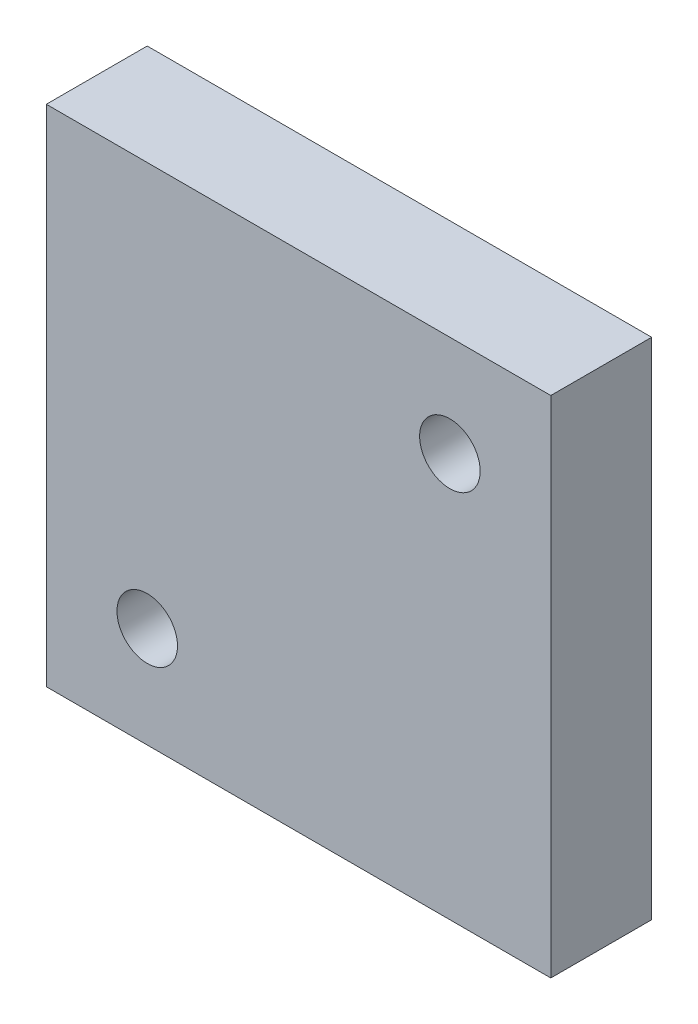
ISO-10303-21;
HEADER;
FILE_DESCRIPTION(('STEP AP214'),'2;1');
FILE_NAME('part.step','',(''),(''),'','','');
FILE_SCHEMA(('AUTOMOTIVE_DESIGN { 1 0 10303 214 1 1 1 1 }'));
ENDSEC;
DATA;
#1=APPLICATION_CONTEXT('core data for automotive mechanical design processes');
#2=APPLICATION_PROTOCOL_DEFINITION('international standard','automotive_design',2000,#1);
#3=PRODUCT_CONTEXT('',#1,'mechanical');
#4=PRODUCT('Part','Part','',(#3));
#5=PRODUCT_RELATED_PRODUCT_CATEGORY('part','',(#4));
#6=PRODUCT_DEFINITION_FORMATION('','',#4);
#7=PRODUCT_DEFINITION_CONTEXT('part definition',#1,'design');
#8=PRODUCT_DEFINITION('design','',#6,#7);
#9=PRODUCT_DEFINITION_SHAPE('','',#8);
#10=(LENGTH_UNIT() NAMED_UNIT(*) SI_UNIT(.MILLI.,.METRE.));
#11=(NAMED_UNIT(*) PLANE_ANGLE_UNIT() SI_UNIT($,.RADIAN.));
#12=(NAMED_UNIT(*) SI_UNIT($,.STERADIAN.) SOLID_ANGLE_UNIT());
#13=UNCERTAINTY_MEASURE_WITH_UNIT(LENGTH_MEASURE(1.E-05),#10,'distance_accuracy_value','');
#14=(GEOMETRIC_REPRESENTATION_CONTEXT(3) GLOBAL_UNCERTAINTY_ASSIGNED_CONTEXT((#13)) GLOBAL_UNIT_ASSIGNED_CONTEXT((#10,
#11,#12)) REPRESENTATION_CONTEXT('',''));
#15=CARTESIAN_POINT('',(0.,0.,0.));
#16=DIRECTION('',(0.,0.,1.));
#17=DIRECTION('',(1.,0.,0.));
#18=AXIS2_PLACEMENT_3D('',#15,#16,#17);
#19=CARTESIAN_POINT('',(0.,0.,20.));
#20=DIRECTION('',(1.,0.,0.));
#21=DIRECTION('',(0.,0.,-1.));
#22=AXIS2_PLACEMENT_3D('',#19,#20,#21);
#23=PLANE('',#22);
#24=DIRECTION('',(0.,-1.,0.));
#25=VECTOR('',#24,1.);
#26=CARTESIAN_POINT('',(0.,0.,0.));
#27=LINE('',#26,#25);
#28=CARTESIAN_POINT('',(0.,100.,0.));
#29=VERTEX_POINT('',#28);
#30=CARTESIAN_POINT('',(0.,0.,0.));
#31=VERTEX_POINT('',#30);
#32=EDGE_CURVE('E96',#29,#31,#27,.T.);
#33=ORIENTED_EDGE('',*,*,#32,.T.);
#34=DIRECTION('',(0.,0.,-1.));
#35=VECTOR('',#34,1.);
#36=CARTESIAN_POINT('',(0.,0.,20.));
#37=LINE('',#36,#35);
#38=CARTESIAN_POINT('',(0.,0.,20.));
#39=VERTEX_POINT('',#38);
#40=EDGE_CURVE('E11',#39,#31,#37,.T.);
#41=ORIENTED_EDGE('',*,*,#40,.F.);
#42=DIRECTION('',(0.,-1.,0.));
#43=VECTOR('',#42,1.);
#44=CARTESIAN_POINT('',(0.,0.,20.));
#45=LINE('',#44,#43);
#46=CARTESIAN_POINT('',(0.,100.,20.));
#47=VERTEX_POINT('',#46);
#48=EDGE_CURVE('E84',#47,#39,#45,.T.);
#49=ORIENTED_EDGE('',*,*,#48,.F.);
#50=DIRECTION('',(0.,0.,-1.));
#51=VECTOR('',#50,1.);
#52=CARTESIAN_POINT('',(0.,100.,20.));
#53=LINE('',#52,#51);
#54=EDGE_CURVE('E92',#47,#29,#53,.T.);
#55=ORIENTED_EDGE('',*,*,#54,.T.);
#56=EDGE_LOOP('',(#33,#41,#49,#55));
#57=FACE_BOUND('',#56,.T.);
#58=ADVANCED_FACE('F33',(#57),#23,.F.);
#59=CARTESIAN_POINT('',(0.,0.,20.));
#60=DIRECTION('',(0.,1.,0.));
#61=DIRECTION('',(0.,0.,1.));
#62=AXIS2_PLACEMENT_3D('',#59,#60,#61);
#63=PLANE('',#62);
#64=DIRECTION('',(1.,0.,0.));
#65=VECTOR('',#64,1.);
#66=CARTESIAN_POINT('',(0.,0.,0.));
#67=LINE('',#66,#65);
#68=CARTESIAN_POINT('',(100.,0.,0.));
#69=VERTEX_POINT('',#68);
#70=EDGE_CURVE('E88',#31,#69,#67,.T.);
#71=ORIENTED_EDGE('',*,*,#70,.T.);
#72=DIRECTION('',(0.,0.,-1.));
#73=VECTOR('',#72,1.);
#74=CARTESIAN_POINT('',(100.,0.,20.));
#75=LINE('',#74,#73);
#76=CARTESIAN_POINT('',(100.,0.,20.));
#77=VERTEX_POINT('',#76);
#78=EDGE_CURVE('E41',#77,#69,#75,.T.);
#79=ORIENTED_EDGE('',*,*,#78,.F.);
#80=DIRECTION('',(1.,0.,0.));
#81=VECTOR('',#80,1.);
#82=CARTESIAN_POINT('',(0.,0.,20.));
#83=LINE('',#82,#81);
#84=EDGE_CURVE('E79',#39,#77,#83,.T.);
#85=ORIENTED_EDGE('',*,*,#84,.F.);
#86=ORIENTED_EDGE('',*,*,#40,.T.);
#87=EDGE_LOOP('',(#71,#79,#85,#86));
#88=FACE_BOUND('',#87,.T.);
#89=ADVANCED_FACE('F87',(#88),#63,.F.);
#90=CARTESIAN_POINT('',(100.,0.,20.));
#91=DIRECTION('',(-1.,0.,0.));
#92=DIRECTION('',(0.,0.,1.));
#93=AXIS2_PLACEMENT_3D('',#90,#91,#92);
#94=PLANE('',#93);
#95=DIRECTION('',(0.,1.,0.));
#96=VECTOR('',#95,1.);
#97=CARTESIAN_POINT('',(100.,0.,0.));
#98=LINE('',#97,#96);
#99=CARTESIAN_POINT('',(100.,100.,0.));
#100=VERTEX_POINT('',#99);
#101=EDGE_CURVE('E66',#69,#100,#98,.T.);
#102=ORIENTED_EDGE('',*,*,#101,.T.);
#103=DIRECTION('',(0.,0.,-1.));
#104=VECTOR('',#103,1.);
#105=CARTESIAN_POINT('',(100.,100.,20.));
#106=LINE('',#105,#104);
#107=CARTESIAN_POINT('',(100.,100.,20.));
#108=VERTEX_POINT('',#107);
#109=EDGE_CURVE('E89',#108,#100,#106,.T.);
#110=ORIENTED_EDGE('',*,*,#109,.F.);
#111=DIRECTION('',(0.,1.,0.));
#112=VECTOR('',#111,1.);
#113=CARTESIAN_POINT('',(100.,0.,20.));
#114=LINE('',#113,#112);
#115=EDGE_CURVE('E82',#77,#108,#114,.T.);
#116=ORIENTED_EDGE('',*,*,#115,.F.);
#117=ORIENTED_EDGE('',*,*,#78,.T.);
#118=EDGE_LOOP('',(#102,#110,#116,#117));
#119=FACE_BOUND('',#118,.T.);
#120=ADVANCED_FACE('F90',(#119),#94,.F.);
#121=CARTESIAN_POINT('',(0.,100.,20.));
#122=DIRECTION('',(0.,-1.,0.));
#123=DIRECTION('',(0.,0.,-1.));
#124=AXIS2_PLACEMENT_3D('',#121,#122,#123);
#125=PLANE('',#124);
#126=DIRECTION('',(-1.,0.,0.));
#127=VECTOR('',#126,1.);
#128=CARTESIAN_POINT('',(0.,100.,0.));
#129=LINE('',#128,#127);
#130=EDGE_CURVE('E72',#100,#29,#129,.T.);
#131=ORIENTED_EDGE('',*,*,#130,.T.);
#132=ORIENTED_EDGE('',*,*,#54,.F.);
#133=DIRECTION('',(-1.,0.,0.));
#134=VECTOR('',#133,1.);
#135=CARTESIAN_POINT('',(0.,100.,20.));
#136=LINE('',#135,#134);
#137=EDGE_CURVE('E49',#108,#47,#136,.T.);
#138=ORIENTED_EDGE('',*,*,#137,.F.);
#139=ORIENTED_EDGE('',*,*,#109,.T.);
#140=EDGE_LOOP('',(#131,#132,#138,#139));
#141=FACE_BOUND('',#140,.T.);
#142=ADVANCED_FACE('F104',(#141),#125,.F.);
#143=CARTESIAN_POINT('',(0.,0.,20.));
#144=DIRECTION('',(0.,0.,-1.));
#145=DIRECTION('',(-1.,0.,0.));
#146=AXIS2_PLACEMENT_3D('',#143,#144,#145);
#147=PLANE('',#146);
#148=CARTESIAN_POINT('',(20.,20.,20.));
#149=DIRECTION('',(0.,0.,1.));
#150=DIRECTION('',(1.,0.,0.));
#151=AXIS2_PLACEMENT_3D('',#148,#149,#150);
#152=CIRCLE('',#151,5.99999999999999);
#153=CARTESIAN_POINT('',(26.,20.,20.));
#154=VERTEX_POINT('',#153);
#155=EDGE_CURVE('E118',#154,#154,#152,.T.);
#156=ORIENTED_EDGE('',*,*,#155,.F.);
#157=EDGE_LOOP('',(#156));
#158=FACE_BOUND('',#157,.T.);
#159=CARTESIAN_POINT('',(80.,80.,20.));
#160=DIRECTION('',(0.,0.,1.));
#161=DIRECTION('',(1.,0.,0.));
#162=AXIS2_PLACEMENT_3D('',#159,#160,#161);
#163=CIRCLE('',#162,5.99999999999999);
#164=CARTESIAN_POINT('',(86.,80.,20.));
#165=VERTEX_POINT('',#164);
#166=EDGE_CURVE('E112',#165,#165,#163,.T.);
#167=ORIENTED_EDGE('',*,*,#166,.F.);
#168=EDGE_LOOP('',(#167));
#169=FACE_BOUND('',#168,.T.);
#170=ORIENTED_EDGE('',*,*,#48,.T.);
#171=ORIENTED_EDGE('',*,*,#84,.T.);
#172=ORIENTED_EDGE('',*,*,#115,.T.);
#173=ORIENTED_EDGE('',*,*,#137,.T.);
#174=EDGE_LOOP('',(#170,#171,#172,#173));
#175=FACE_BOUND('',#174,.T.);
#176=ADVANCED_FACE('F80',(#158,#169,#175),#147,.F.);
#177=CARTESIAN_POINT('',(0.,0.,0.));
#178=DIRECTION('',(0.,0.,-1.));
#179=DIRECTION('',(-1.,0.,0.));
#180=AXIS2_PLACEMENT_3D('',#177,#178,#179);
#181=PLANE('',#180);
#182=CARTESIAN_POINT('',(20.,20.,0.));
#183=DIRECTION('',(0.,0.,1.));
#184=DIRECTION('',(1.,0.,0.));
#185=AXIS2_PLACEMENT_3D('',#182,#183,#184);
#186=CIRCLE('',#185,6.);
#187=CARTESIAN_POINT('',(26.,20.,0.));
#188=VERTEX_POINT('',#187);
#189=EDGE_CURVE('E115',#188,#188,#186,.T.);
#190=ORIENTED_EDGE('',*,*,#189,.T.);
#191=EDGE_LOOP('',(#190));
#192=FACE_BOUND('',#191,.T.);
#193=CARTESIAN_POINT('',(80.,80.,0.));
#194=DIRECTION('',(0.,0.,1.));
#195=DIRECTION('',(1.,0.,0.));
#196=AXIS2_PLACEMENT_3D('',#193,#194,#195);
#197=CIRCLE('',#196,5.99999999999999);
#198=CARTESIAN_POINT('',(86.,80.,0.));
#199=VERTEX_POINT('',#198);
#200=EDGE_CURVE('E99',#199,#199,#197,.T.);
#201=ORIENTED_EDGE('',*,*,#200,.T.);
#202=EDGE_LOOP('',(#201));
#203=FACE_BOUND('',#202,.T.);
#204=ORIENTED_EDGE('',*,*,#32,.F.);
#205=ORIENTED_EDGE('',*,*,#130,.F.);
#206=ORIENTED_EDGE('',*,*,#101,.F.);
#207=ORIENTED_EDGE('',*,*,#70,.F.);
#208=EDGE_LOOP('',(#204,#205,#206,#207));
#209=FACE_BOUND('',#208,.T.);
#210=ADVANCED_FACE('F107',(#192,#203,#209),#181,.T.);
#211=CARTESIAN_POINT('',(80.,80.,20.));
#212=DIRECTION('',(0.,0.,1.));
#213=DIRECTION('',(1.,0.,0.));
#214=AXIS2_PLACEMENT_3D('',#211,#212,#213);
#215=CYLINDRICAL_SURFACE('',#214,5.99999999999999);
#216=ORIENTED_EDGE('',*,*,#200,.F.);
#217=EDGE_LOOP('',(#216));
#218=FACE_BOUND('',#217,.T.);
#219=ORIENTED_EDGE('',*,*,#166,.T.);
#220=EDGE_LOOP('',(#219));
#221=FACE_BOUND('',#220,.T.);
#222=ADVANCED_FACE('F129',(#218,#221),#215,.F.);
#223=CARTESIAN_POINT('',(20.,20.,20.));
#224=DIRECTION('',(0.,0.,1.));
#225=DIRECTION('',(1.,0.,0.));
#226=AXIS2_PLACEMENT_3D('',#223,#224,#225);
#227=CYLINDRICAL_SURFACE('',#226,5.99999999999999);
#228=ORIENTED_EDGE('',*,*,#189,.F.);
#229=EDGE_LOOP('',(#228));
#230=FACE_BOUND('',#229,.T.);
#231=ORIENTED_EDGE('',*,*,#155,.T.);
#232=EDGE_LOOP('',(#231));
#233=FACE_BOUND('',#232,.T.);
#234=ADVANCED_FACE('F122',(#230,#233),#227,.F.);
#235=CLOSED_SHELL('',(#58,#89,#120,#142,#176,#210,#222,#234));
#236=MANIFOLD_SOLID_BREP('B2',#235);
#237=ADVANCED_BREP_SHAPE_REPRESENTATION('',(#18,#236),#14);
#238=SHAPE_DEFINITION_REPRESENTATION(#9,#237);
ENDSEC;
END-ISO-10303-21;
